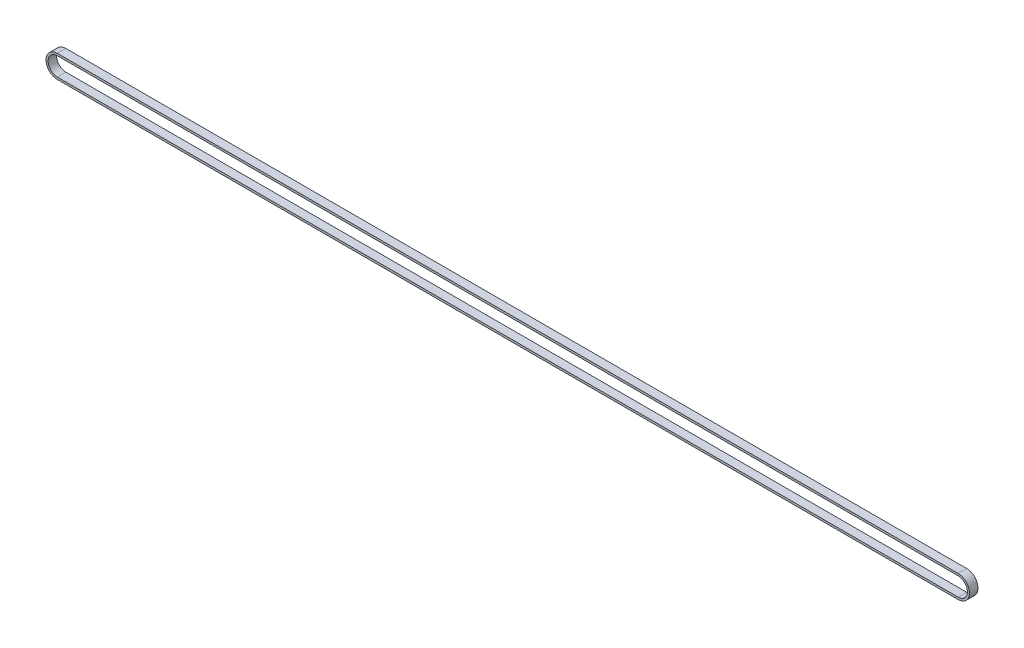
ISO-10303-21;
HEADER;
FILE_DESCRIPTION(('STEP AP214'),'2;1');
FILE_NAME('part.step','',(''),(''),'','','');
FILE_SCHEMA(('AUTOMOTIVE_DESIGN { 1 0 10303 214 1 1 1 1 }'));
ENDSEC;
DATA;
#1=APPLICATION_CONTEXT('core data for automotive mechanical design processes');
#2=APPLICATION_PROTOCOL_DEFINITION('international standard','automotive_design',2000,#1);
#3=PRODUCT_CONTEXT('',#1,'mechanical');
#4=PRODUCT('Part','Part','',(#3));
#5=PRODUCT_RELATED_PRODUCT_CATEGORY('part','',(#4));
#6=PRODUCT_DEFINITION_FORMATION('','',#4);
#7=PRODUCT_DEFINITION_CONTEXT('part definition',#1,'design');
#8=PRODUCT_DEFINITION('design','',#6,#7);
#9=PRODUCT_DEFINITION_SHAPE('','',#8);
#10=(LENGTH_UNIT() NAMED_UNIT(*) SI_UNIT(.MILLI.,.METRE.));
#11=(NAMED_UNIT(*) PLANE_ANGLE_UNIT() SI_UNIT($,.RADIAN.));
#12=(NAMED_UNIT(*) SI_UNIT($,.STERADIAN.) SOLID_ANGLE_UNIT());
#13=UNCERTAINTY_MEASURE_WITH_UNIT(LENGTH_MEASURE(1.E-05),#10,'distance_accuracy_value','');
#14=(GEOMETRIC_REPRESENTATION_CONTEXT(3) GLOBAL_UNCERTAINTY_ASSIGNED_CONTEXT((#13)) GLOBAL_UNIT_ASSIGNED_CONTEXT((#10,
#11,#12)) REPRESENTATION_CONTEXT('',''));
#15=CARTESIAN_POINT('',(0.,0.,0.));
#16=DIRECTION('',(0.,0.,1.));
#17=DIRECTION('',(1.,0.,0.));
#18=AXIS2_PLACEMENT_3D('',#15,#16,#17);
#19=CARTESIAN_POINT('',(-317.5,-7.00000000000006,3.));
#20=DIRECTION('',(0.,0.,1.));
#21=DIRECTION('',(1.,0.,0.));
#22=AXIS2_PLACEMENT_3D('',#19,#20,#21);
#23=PLANE('',#22);
#24=CARTESIAN_POINT('',(-317.5,-7.00000000000006,3.));
#25=DIRECTION('',(0.,0.,1.));
#26=DIRECTION('',(1.,0.,0.));
#27=AXIS2_PLACEMENT_3D('',#24,#25,#26);
#28=CIRCLE('',#27,8.);
#29=CARTESIAN_POINT('',(-317.5,0.999999999999942,3.));
#30=VERTEX_POINT('',#29);
#31=CARTESIAN_POINT('',(-317.5,-15.0000000000001,3.));
#32=VERTEX_POINT('',#31);
#33=EDGE_CURVE('E160',#30,#32,#28,.T.);
#34=ORIENTED_EDGE('',*,*,#33,.T.);
#35=DIRECTION('',(1.,0.,0.));
#36=VECTOR('',#35,1.);
#37=CARTESIAN_POINT('',(-317.5,-15.0000000000001,3.));
#38=LINE('',#37,#36);
#39=CARTESIAN_POINT('',(317.5,-15.,3.));
#40=VERTEX_POINT('',#39);
#41=EDGE_CURVE('E163',#32,#40,#38,.T.);
#42=ORIENTED_EDGE('',*,*,#41,.T.);
#43=CARTESIAN_POINT('',(317.5,-6.99999999999994,3.));
#44=DIRECTION('',(0.,0.,1.));
#45=DIRECTION('',(1.,0.,0.));
#46=AXIS2_PLACEMENT_3D('',#43,#44,#45);
#47=CIRCLE('',#46,7.99999999999998);
#48=CARTESIAN_POINT('',(317.5,1.00000000000004,3.));
#49=VERTEX_POINT('',#48);
#50=EDGE_CURVE('E166',#40,#49,#47,.T.);
#51=ORIENTED_EDGE('',*,*,#50,.T.);
#52=DIRECTION('',(-1.,0.,0.));
#53=VECTOR('',#52,1.);
#54=CARTESIAN_POINT('',(317.5,0.999999999999942,3.));
#55=LINE('',#54,#53);
#56=EDGE_CURVE('E168',#49,#30,#55,.T.);
#57=ORIENTED_EDGE('',*,*,#56,.T.);
#58=EDGE_LOOP('',(#34,#42,#51,#57));
#59=FACE_BOUND('',#58,.T.);
#60=DIRECTION('',(1.,0.,0.));
#61=VECTOR('',#60,1.);
#62=CARTESIAN_POINT('',(-317.5,-13.5000000000001,3.));
#63=LINE('',#62,#61);
#64=CARTESIAN_POINT('',(-317.5,-13.5000000000001,3.));
#65=VERTEX_POINT('',#64);
#66=CARTESIAN_POINT('',(317.5,-13.5,3.));
#67=VERTEX_POINT('',#66);
#68=EDGE_CURVE('E132',#65,#67,#63,.T.);
#69=ORIENTED_EDGE('',*,*,#68,.F.);
#70=CARTESIAN_POINT('',(-317.5,-7.00000000000006,3.));
#71=DIRECTION('',(0.,0.,1.));
#72=DIRECTION('',(1.,0.,0.));
#73=AXIS2_PLACEMENT_3D('',#70,#71,#72);
#74=CIRCLE('',#73,6.5);
#75=CARTESIAN_POINT('',(-317.5,-0.500000000000058,3.));
#76=VERTEX_POINT('',#75);
#77=EDGE_CURVE('E124',#76,#65,#74,.T.);
#78=ORIENTED_EDGE('',*,*,#77,.F.);
#79=DIRECTION('',(-1.,0.,0.));
#80=VECTOR('',#79,1.);
#81=CARTESIAN_POINT('',(317.5,-0.500000000000058,3.));
#82=LINE('',#81,#80);
#83=CARTESIAN_POINT('',(317.5,-0.500000000000059,3.));
#84=VERTEX_POINT('',#83);
#85=EDGE_CURVE('E146',#84,#76,#82,.T.);
#86=ORIENTED_EDGE('',*,*,#85,.F.);
#87=CARTESIAN_POINT('',(317.5,-6.99999999999994,3.));
#88=DIRECTION('',(0.,0.,1.));
#89=DIRECTION('',(1.,0.,0.));
#90=AXIS2_PLACEMENT_3D('',#87,#88,#89);
#91=CIRCLE('',#90,6.49999999999998);
#92=EDGE_CURVE('E144',#67,#84,#91,.T.);
#93=ORIENTED_EDGE('',*,*,#92,.F.);
#94=EDGE_LOOP('',(#69,#78,#86,#93));
#95=FACE_BOUND('',#94,.T.);
#96=ADVANCED_FACE('F59',(#59,#95),#23,.T.);
#97=CARTESIAN_POINT('',(-317.5,-7.00000000000006,-3.));
#98=DIRECTION('',(0.,0.,1.));
#99=DIRECTION('',(1.,0.,0.));
#100=AXIS2_PLACEMENT_3D('',#97,#98,#99);
#101=PLANE('',#100);
#102=CARTESIAN_POINT('',(-317.5,-7.00000000000006,-3.));
#103=DIRECTION('',(0.,0.,1.));
#104=DIRECTION('',(1.,0.,0.));
#105=AXIS2_PLACEMENT_3D('',#102,#103,#104);
#106=CIRCLE('',#105,8.);
#107=CARTESIAN_POINT('',(-317.5,0.999999999999942,-3.));
#108=VERTEX_POINT('',#107);
#109=CARTESIAN_POINT('',(-317.5,-15.0000000000001,-3.));
#110=VERTEX_POINT('',#109);
#111=EDGE_CURVE('E140',#108,#110,#106,.T.);
#112=ORIENTED_EDGE('',*,*,#111,.F.);
#113=DIRECTION('',(-1.,0.,0.));
#114=VECTOR('',#113,1.);
#115=CARTESIAN_POINT('',(317.5,0.999999999999942,-3.));
#116=LINE('',#115,#114);
#117=CARTESIAN_POINT('',(317.5,1.00000000000004,-3.));
#118=VERTEX_POINT('',#117);
#119=EDGE_CURVE('E164',#118,#108,#116,.T.);
#120=ORIENTED_EDGE('',*,*,#119,.F.);
#121=CARTESIAN_POINT('',(317.5,-6.99999999999994,-3.));
#122=DIRECTION('',(0.,0.,1.));
#123=DIRECTION('',(1.,0.,0.));
#124=AXIS2_PLACEMENT_3D('',#121,#122,#123);
#125=CIRCLE('',#124,7.99999999999998);
#126=CARTESIAN_POINT('',(317.5,-15.,-3.));
#127=VERTEX_POINT('',#126);
#128=EDGE_CURVE('E175',#127,#118,#125,.T.);
#129=ORIENTED_EDGE('',*,*,#128,.F.);
#130=DIRECTION('',(1.,0.,0.));
#131=VECTOR('',#130,1.);
#132=CARTESIAN_POINT('',(-317.5,-15.0000000000001,-3.));
#133=LINE('',#132,#131);
#134=EDGE_CURVE('E173',#110,#127,#133,.T.);
#135=ORIENTED_EDGE('',*,*,#134,.F.);
#136=EDGE_LOOP('',(#112,#120,#129,#135));
#137=FACE_BOUND('',#136,.T.);
#138=CARTESIAN_POINT('',(-317.5,-7.00000000000006,-3.));
#139=DIRECTION('',(0.,0.,1.));
#140=DIRECTION('',(1.,0.,0.));
#141=AXIS2_PLACEMENT_3D('',#138,#139,#140);
#142=CIRCLE('',#141,6.5);
#143=CARTESIAN_POINT('',(-317.5,-0.500000000000059,-3.));
#144=VERTEX_POINT('',#143);
#145=CARTESIAN_POINT('',(-317.5,-13.5000000000001,-3.));
#146=VERTEX_POINT('',#145);
#147=EDGE_CURVE('E82',#144,#146,#142,.T.);
#148=ORIENTED_EDGE('',*,*,#147,.T.);
#149=DIRECTION('',(1.,0.,0.));
#150=VECTOR('',#149,1.);
#151=CARTESIAN_POINT('',(-317.5,-13.5000000000001,-3.));
#152=LINE('',#151,#150);
#153=CARTESIAN_POINT('',(317.5,-13.5,-3.));
#154=VERTEX_POINT('',#153);
#155=EDGE_CURVE('E139',#146,#154,#152,.T.);
#156=ORIENTED_EDGE('',*,*,#155,.T.);
#157=CARTESIAN_POINT('',(317.5,-6.99999999999994,-3.));
#158=DIRECTION('',(0.,0.,1.));
#159=DIRECTION('',(1.,0.,0.));
#160=AXIS2_PLACEMENT_3D('',#157,#158,#159);
#161=CIRCLE('',#160,6.49999999999998);
#162=CARTESIAN_POINT('',(317.5,-0.499999999999962,-3.));
#163=VERTEX_POINT('',#162);
#164=EDGE_CURVE('E152',#154,#163,#161,.T.);
#165=ORIENTED_EDGE('',*,*,#164,.T.);
#166=DIRECTION('',(-1.,0.,0.));
#167=VECTOR('',#166,1.);
#168=CARTESIAN_POINT('',(317.5,-0.500000000000058,-3.));
#169=LINE('',#168,#167);
#170=EDGE_CURVE('E133',#163,#144,#169,.T.);
#171=ORIENTED_EDGE('',*,*,#170,.T.);
#172=EDGE_LOOP('',(#148,#156,#165,#171));
#173=FACE_BOUND('',#172,.T.);
#174=ADVANCED_FACE('F193',(#137,#173),#101,.F.);
#175=CARTESIAN_POINT('',(-317.5,-7.00000000000006,3.));
#176=DIRECTION('',(0.,0.,-1.));
#177=DIRECTION('',(-1.,0.,0.));
#178=AXIS2_PLACEMENT_3D('',#175,#176,#177);
#179=CYLINDRICAL_SURFACE('',#178,8.);
#180=ORIENTED_EDGE('',*,*,#111,.T.);
#181=DIRECTION('',(0.,0.,-1.));
#182=VECTOR('',#181,1.);
#183=CARTESIAN_POINT('',(-317.5,-15.0000000000001,3.));
#184=LINE('',#183,#182);
#185=EDGE_CURVE('E12',#32,#110,#184,.T.);
#186=ORIENTED_EDGE('',*,*,#185,.F.);
#187=ORIENTED_EDGE('',*,*,#33,.F.);
#188=DIRECTION('',(0.,0.,-1.));
#189=VECTOR('',#188,1.);
#190=CARTESIAN_POINT('',(-317.5,0.999999999999942,3.));
#191=LINE('',#190,#189);
#192=EDGE_CURVE('E170',#30,#108,#191,.T.);
#193=ORIENTED_EDGE('',*,*,#192,.T.);
#194=EDGE_LOOP('',(#180,#186,#187,#193));
#195=FACE_BOUND('',#194,.T.);
#196=ADVANCED_FACE('F61',(#195),#179,.T.);
#197=CARTESIAN_POINT('',(-317.5,-15.0000000000001,3.));
#198=DIRECTION('',(0.,1.,0.));
#199=DIRECTION('',(-1.,0.,0.));
#200=AXIS2_PLACEMENT_3D('',#197,#198,#199);
#201=PLANE('',#200);
#202=ORIENTED_EDGE('',*,*,#134,.T.);
#203=DIRECTION('',(0.,0.,-1.));
#204=VECTOR('',#203,1.);
#205=CARTESIAN_POINT('',(317.5,-15.,3.));
#206=LINE('',#205,#204);
#207=EDGE_CURVE('E67',#40,#127,#206,.T.);
#208=ORIENTED_EDGE('',*,*,#207,.F.);
#209=ORIENTED_EDGE('',*,*,#41,.F.);
#210=ORIENTED_EDGE('',*,*,#185,.T.);
#211=EDGE_LOOP('',(#202,#208,#209,#210));
#212=FACE_BOUND('',#211,.T.);
#213=ADVANCED_FACE('F203',(#212),#201,.F.);
#214=CARTESIAN_POINT('',(317.5,-6.99999999999994,3.));
#215=DIRECTION('',(0.,0.,-1.));
#216=DIRECTION('',(-1.,0.,0.));
#217=AXIS2_PLACEMENT_3D('',#214,#215,#216);
#218=CYLINDRICAL_SURFACE('',#217,7.99999999999998);
#219=ORIENTED_EDGE('',*,*,#128,.T.);
#220=DIRECTION('',(0.,0.,-1.));
#221=VECTOR('',#220,1.);
#222=CARTESIAN_POINT('',(317.5,1.00000000000004,3.));
#223=LINE('',#222,#221);
#224=EDGE_CURVE('E180',#49,#118,#223,.T.);
#225=ORIENTED_EDGE('',*,*,#224,.F.);
#226=ORIENTED_EDGE('',*,*,#50,.F.);
#227=ORIENTED_EDGE('',*,*,#207,.T.);
#228=EDGE_LOOP('',(#219,#225,#226,#227));
#229=FACE_BOUND('',#228,.T.);
#230=ADVANCED_FACE('F187',(#229),#218,.T.);
#231=CARTESIAN_POINT('',(317.5,0.999999999999942,3.));
#232=DIRECTION('',(0.,-1.,0.));
#233=DIRECTION('',(0.,0.,-1.));
#234=AXIS2_PLACEMENT_3D('',#231,#232,#233);
#235=PLANE('',#234);
#236=ORIENTED_EDGE('',*,*,#119,.T.);
#237=ORIENTED_EDGE('',*,*,#192,.F.);
#238=ORIENTED_EDGE('',*,*,#56,.F.);
#239=ORIENTED_EDGE('',*,*,#224,.T.);
#240=EDGE_LOOP('',(#236,#237,#238,#239));
#241=FACE_BOUND('',#240,.T.);
#242=ADVANCED_FACE('F197',(#241),#235,.F.);
#243=CARTESIAN_POINT('',(-317.5,-7.00000000000006,3.));
#244=DIRECTION('',(0.,0.,-1.));
#245=DIRECTION('',(-1.,0.,0.));
#246=AXIS2_PLACEMENT_3D('',#243,#244,#245);
#247=CYLINDRICAL_SURFACE('',#246,6.5);
#248=ORIENTED_EDGE('',*,*,#147,.F.);
#249=DIRECTION('',(0.,0.,-1.));
#250=VECTOR('',#249,1.);
#251=CARTESIAN_POINT('',(-317.5,-0.500000000000058,3.));
#252=LINE('',#251,#250);
#253=EDGE_CURVE('E128',#76,#144,#252,.T.);
#254=ORIENTED_EDGE('',*,*,#253,.F.);
#255=ORIENTED_EDGE('',*,*,#77,.T.);
#256=DIRECTION('',(0.,0.,-1.));
#257=VECTOR('',#256,1.);
#258=CARTESIAN_POINT('',(-317.5,-13.5000000000001,3.));
#259=LINE('',#258,#257);
#260=EDGE_CURVE('E127',#65,#146,#259,.T.);
#261=ORIENTED_EDGE('',*,*,#260,.T.);
#262=EDGE_LOOP('',(#248,#254,#255,#261));
#263=FACE_BOUND('',#262,.T.);
#264=ADVANCED_FACE('F126',(#263),#247,.F.);
#265=CARTESIAN_POINT('',(-317.5,-13.5000000000001,3.));
#266=DIRECTION('',(0.,1.,0.));
#267=DIRECTION('',(-1.,0.,0.));
#268=AXIS2_PLACEMENT_3D('',#265,#266,#267);
#269=PLANE('',#268);
#270=ORIENTED_EDGE('',*,*,#155,.F.);
#271=ORIENTED_EDGE('',*,*,#260,.F.);
#272=ORIENTED_EDGE('',*,*,#68,.T.);
#273=DIRECTION('',(0.,0.,-1.));
#274=VECTOR('',#273,1.);
#275=CARTESIAN_POINT('',(317.5,-13.5,3.));
#276=LINE('',#275,#274);
#277=EDGE_CURVE('E141',#67,#154,#276,.T.);
#278=ORIENTED_EDGE('',*,*,#277,.T.);
#279=EDGE_LOOP('',(#270,#271,#272,#278));
#280=FACE_BOUND('',#279,.T.);
#281=ADVANCED_FACE('F136',(#280),#269,.T.);
#282=CARTESIAN_POINT('',(317.5,-6.99999999999994,3.));
#283=DIRECTION('',(0.,0.,-1.));
#284=DIRECTION('',(-1.,0.,0.));
#285=AXIS2_PLACEMENT_3D('',#282,#283,#284);
#286=CYLINDRICAL_SURFACE('',#285,6.49999999999998);
#287=ORIENTED_EDGE('',*,*,#164,.F.);
#288=ORIENTED_EDGE('',*,*,#277,.F.);
#289=ORIENTED_EDGE('',*,*,#92,.T.);
#290=DIRECTION('',(0.,0.,-1.));
#291=VECTOR('',#290,1.);
#292=CARTESIAN_POINT('',(317.5,-0.499999999999962,3.));
#293=LINE('',#292,#291);
#294=EDGE_CURVE('E74',#84,#163,#293,.T.);
#295=ORIENTED_EDGE('',*,*,#294,.T.);
#296=EDGE_LOOP('',(#287,#288,#289,#295));
#297=FACE_BOUND('',#296,.T.);
#298=ADVANCED_FACE('F226',(#297),#286,.F.);
#299=CARTESIAN_POINT('',(317.5,-0.500000000000058,3.));
#300=DIRECTION('',(0.,-1.,0.));
#301=DIRECTION('',(0.,0.,-1.));
#302=AXIS2_PLACEMENT_3D('',#299,#300,#301);
#303=PLANE('',#302);
#304=ORIENTED_EDGE('',*,*,#170,.F.);
#305=ORIENTED_EDGE('',*,*,#294,.F.);
#306=ORIENTED_EDGE('',*,*,#85,.T.);
#307=ORIENTED_EDGE('',*,*,#253,.T.);
#308=EDGE_LOOP('',(#304,#305,#306,#307));
#309=FACE_BOUND('',#308,.T.);
#310=ADVANCED_FACE('F230',(#309),#303,.T.);
#311=CLOSED_SHELL('',(#96,#174,#196,#213,#230,#242,#264,#281,#298,#310));
#312=MANIFOLD_SOLID_BREP('B2',#311);
#313=ADVANCED_BREP_SHAPE_REPRESENTATION('',(#18,#312),#14);
#314=SHAPE_DEFINITION_REPRESENTATION(#9,#313);
ENDSEC;
END-ISO-10303-21;
